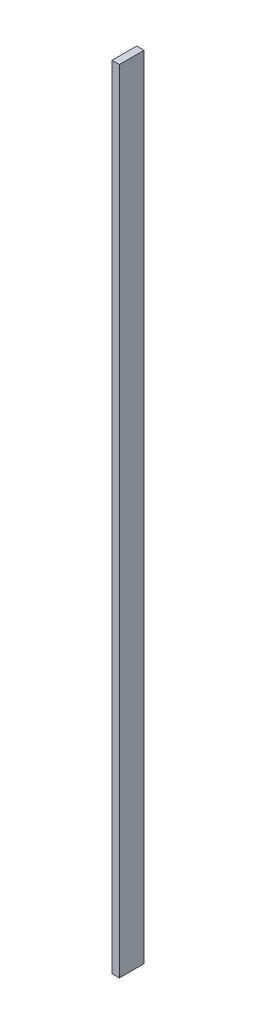
ISO-10303-21;
HEADER;
FILE_DESCRIPTION(('STEP AP214'),'2;1');
FILE_NAME('part.step','',(''),(''),'','','');
FILE_SCHEMA(('AUTOMOTIVE_DESIGN { 1 0 10303 214 1 1 1 1 }'));
ENDSEC;
DATA;
#1=APPLICATION_CONTEXT('core data for automotive mechanical design processes');
#2=APPLICATION_PROTOCOL_DEFINITION('international standard','automotive_design',2000,#1);
#3=PRODUCT_CONTEXT('',#1,'mechanical');
#4=PRODUCT('Part','Part','',(#3));
#5=PRODUCT_RELATED_PRODUCT_CATEGORY('part','',(#4));
#6=PRODUCT_DEFINITION_FORMATION('','',#4);
#7=PRODUCT_DEFINITION_CONTEXT('part definition',#1,'design');
#8=PRODUCT_DEFINITION('design','',#6,#7);
#9=PRODUCT_DEFINITION_SHAPE('','',#8);
#10=(LENGTH_UNIT() NAMED_UNIT(*) SI_UNIT(.MILLI.,.METRE.));
#11=(NAMED_UNIT(*) PLANE_ANGLE_UNIT() SI_UNIT($,.RADIAN.));
#12=(NAMED_UNIT(*) SI_UNIT($,.STERADIAN.) SOLID_ANGLE_UNIT());
#13=UNCERTAINTY_MEASURE_WITH_UNIT(LENGTH_MEASURE(1.E-05),#10,'distance_accuracy_value','');
#14=(GEOMETRIC_REPRESENTATION_CONTEXT(3) GLOBAL_UNCERTAINTY_ASSIGNED_CONTEXT((#13)) GLOBAL_UNIT_ASSIGNED_CONTEXT((#10,
#11,#12)) REPRESENTATION_CONTEXT('',''));
#15=CARTESIAN_POINT('',(0.,0.,0.));
#16=DIRECTION('',(0.,0.,1.));
#17=DIRECTION('',(1.,0.,0.));
#18=AXIS2_PLACEMENT_3D('',#15,#16,#17);
#19=CARTESIAN_POINT('',(0.,0.,0.));
#20=DIRECTION('',(1.,0.,0.));
#21=DIRECTION('',(0.,0.,-1.));
#22=AXIS2_PLACEMENT_3D('',#19,#20,#21);
#23=PLANE('',#22);
#24=DIRECTION('',(0.,1.,0.));
#25=VECTOR('',#24,1.);
#26=CARTESIAN_POINT('',(0.,1016.,15.875));
#27=LINE('',#26,#25);
#28=CARTESIAN_POINT('',(0.,1016.,15.875));
#29=VERTEX_POINT('',#28);
#30=CARTESIAN_POINT('',(0.,0.,15.875));
#31=VERTEX_POINT('',#30);
#32=EDGE_CURVE('E95',#29,#31,#27,.F.);
#33=ORIENTED_EDGE('',*,*,#32,.F.);
#34=DIRECTION('',(0.,0.,1.));
#35=VECTOR('',#34,1.);
#36=CARTESIAN_POINT('',(0.,1016.,-15.875));
#37=LINE('',#36,#35);
#38=CARTESIAN_POINT('',(0.,1016.,-15.875));
#39=VERTEX_POINT('',#38);
#40=EDGE_CURVE('E71',#39,#29,#37,.T.);
#41=ORIENTED_EDGE('',*,*,#40,.F.);
#42=DIRECTION('',(0.,1.,0.));
#43=VECTOR('',#42,1.);
#44=CARTESIAN_POINT('',(0.,0.,-15.875));
#45=LINE('',#44,#43);
#46=CARTESIAN_POINT('',(0.,0.,-15.875));
#47=VERTEX_POINT('',#46);
#48=EDGE_CURVE('E73',#47,#39,#45,.T.);
#49=ORIENTED_EDGE('',*,*,#48,.F.);
#50=DIRECTION('',(0.,0.,-1.));
#51=VECTOR('',#50,1.);
#52=CARTESIAN_POINT('',(0.,0.,15.875));
#53=LINE('',#52,#51);
#54=EDGE_CURVE('E36',#31,#47,#53,.T.);
#55=ORIENTED_EDGE('',*,*,#54,.F.);
#56=EDGE_LOOP('',(#33,#41,#49,#55));
#57=FACE_BOUND('',#56,.T.);
#58=ADVANCED_FACE('F33',(#57),#23,.F.);
#59=CARTESIAN_POINT('',(0.,0.,15.875));
#60=DIRECTION('',(0.,-1.,0.));
#61=DIRECTION('',(0.,0.,-1.));
#62=AXIS2_PLACEMENT_3D('',#59,#60,#61);
#63=PLANE('',#62);
#64=DIRECTION('',(0.,0.,-1.));
#65=VECTOR('',#64,1.);
#66=CARTESIAN_POINT('',(9.525,0.,0.));
#67=LINE('',#66,#65);
#68=CARTESIAN_POINT('',(9.525,0.,15.875));
#69=VERTEX_POINT('',#68);
#70=CARTESIAN_POINT('',(9.525,0.,-15.875));
#71=VERTEX_POINT('',#70);
#72=EDGE_CURVE('E99',#69,#71,#67,.T.);
#73=ORIENTED_EDGE('',*,*,#72,.F.);
#74=DIRECTION('',(1.,0.,0.));
#75=VECTOR('',#74,1.);
#76=CARTESIAN_POINT('',(0.,0.,15.875));
#77=LINE('',#76,#75);
#78=EDGE_CURVE('E84',#31,#69,#77,.T.);
#79=ORIENTED_EDGE('',*,*,#78,.F.);
#80=ORIENTED_EDGE('',*,*,#54,.T.);
#81=DIRECTION('',(-1.,0.,0.));
#82=VECTOR('',#81,1.);
#83=CARTESIAN_POINT('',(0.,0.,-15.875));
#84=LINE('',#83,#82);
#85=EDGE_CURVE('E79',#71,#47,#84,.T.);
#86=ORIENTED_EDGE('',*,*,#85,.F.);
#87=EDGE_LOOP('',(#73,#79,#80,#86));
#88=FACE_BOUND('',#87,.T.);
#89=ADVANCED_FACE('F81',(#88),#63,.T.);
#90=CARTESIAN_POINT('',(0.,0.,-15.875));
#91=DIRECTION('',(0.,0.,-1.));
#92=DIRECTION('',(-1.,0.,0.));
#93=AXIS2_PLACEMENT_3D('',#90,#91,#92);
#94=PLANE('',#93);
#95=DIRECTION('',(0.,1.,0.));
#96=VECTOR('',#95,1.);
#97=CARTESIAN_POINT('',(9.525,0.,-15.875));
#98=LINE('',#97,#96);
#99=CARTESIAN_POINT('',(9.525,1016.,-15.875));
#100=VERTEX_POINT('',#99);
#101=EDGE_CURVE('E88',#71,#100,#98,.T.);
#102=ORIENTED_EDGE('',*,*,#101,.F.);
#103=ORIENTED_EDGE('',*,*,#85,.T.);
#104=ORIENTED_EDGE('',*,*,#48,.T.);
#105=DIRECTION('',(1.,0.,0.));
#106=VECTOR('',#105,1.);
#107=CARTESIAN_POINT('',(0.,1016.,-15.875));
#108=LINE('',#107,#106);
#109=EDGE_CURVE('E91',#100,#39,#108,.F.);
#110=ORIENTED_EDGE('',*,*,#109,.F.);
#111=EDGE_LOOP('',(#102,#103,#104,#110));
#112=FACE_BOUND('',#111,.T.);
#113=ADVANCED_FACE('F86',(#112),#94,.T.);
#114=CARTESIAN_POINT('',(0.,1016.,-15.875));
#115=DIRECTION('',(0.,1.,0.));
#116=DIRECTION('',(0.,0.,1.));
#117=AXIS2_PLACEMENT_3D('',#114,#115,#116);
#118=PLANE('',#117);
#119=DIRECTION('',(0.,0.,-1.));
#120=VECTOR('',#119,1.);
#121=CARTESIAN_POINT('',(9.525,1016.,0.));
#122=LINE('',#121,#120);
#123=CARTESIAN_POINT('',(9.525,1016.,15.875));
#124=VERTEX_POINT('',#123);
#125=EDGE_CURVE('E42',#100,#124,#122,.F.);
#126=ORIENTED_EDGE('',*,*,#125,.F.);
#127=ORIENTED_EDGE('',*,*,#109,.T.);
#128=ORIENTED_EDGE('',*,*,#40,.T.);
#129=DIRECTION('',(1.,0.,0.));
#130=VECTOR('',#129,1.);
#131=CARTESIAN_POINT('',(0.,1016.,15.875));
#132=LINE('',#131,#130);
#133=EDGE_CURVE('E51',#124,#29,#132,.F.);
#134=ORIENTED_EDGE('',*,*,#133,.F.);
#135=EDGE_LOOP('',(#126,#127,#128,#134));
#136=FACE_BOUND('',#135,.T.);
#137=ADVANCED_FACE('F105',(#136),#118,.T.);
#138=CARTESIAN_POINT('',(0.,1016.,15.875));
#139=DIRECTION('',(0.,0.,1.));
#140=DIRECTION('',(1.,0.,0.));
#141=AXIS2_PLACEMENT_3D('',#138,#139,#140);
#142=PLANE('',#141);
#143=DIRECTION('',(0.,1.,0.));
#144=VECTOR('',#143,1.);
#145=CARTESIAN_POINT('',(9.525,0.,15.875));
#146=LINE('',#145,#144);
#147=EDGE_CURVE('E11',#124,#69,#146,.F.);
#148=ORIENTED_EDGE('',*,*,#147,.F.);
#149=ORIENTED_EDGE('',*,*,#133,.T.);
#150=ORIENTED_EDGE('',*,*,#32,.T.);
#151=ORIENTED_EDGE('',*,*,#78,.T.);
#152=EDGE_LOOP('',(#148,#149,#150,#151));
#153=FACE_BOUND('',#152,.T.);
#154=ADVANCED_FACE('F107',(#153),#142,.T.);
#155=CARTESIAN_POINT('',(9.525,0.,0.));
#156=DIRECTION('',(1.,0.,0.));
#157=DIRECTION('',(0.,0.,-1.));
#158=AXIS2_PLACEMENT_3D('',#155,#156,#157);
#159=PLANE('',#158);
#160=ORIENTED_EDGE('',*,*,#125,.T.);
#161=ORIENTED_EDGE('',*,*,#147,.T.);
#162=ORIENTED_EDGE('',*,*,#72,.T.);
#163=ORIENTED_EDGE('',*,*,#101,.T.);
#164=EDGE_LOOP('',(#160,#161,#162,#163));
#165=FACE_BOUND('',#164,.T.);
#166=ADVANCED_FACE('F104',(#165),#159,.T.);
#167=CLOSED_SHELL('',(#58,#89,#113,#137,#154,#166));
#168=MANIFOLD_SOLID_BREP('B2',#167);
#169=ADVANCED_BREP_SHAPE_REPRESENTATION('',(#18,#168),#14);
#170=SHAPE_DEFINITION_REPRESENTATION(#9,#169);
ENDSEC;
END-ISO-10303-21;
